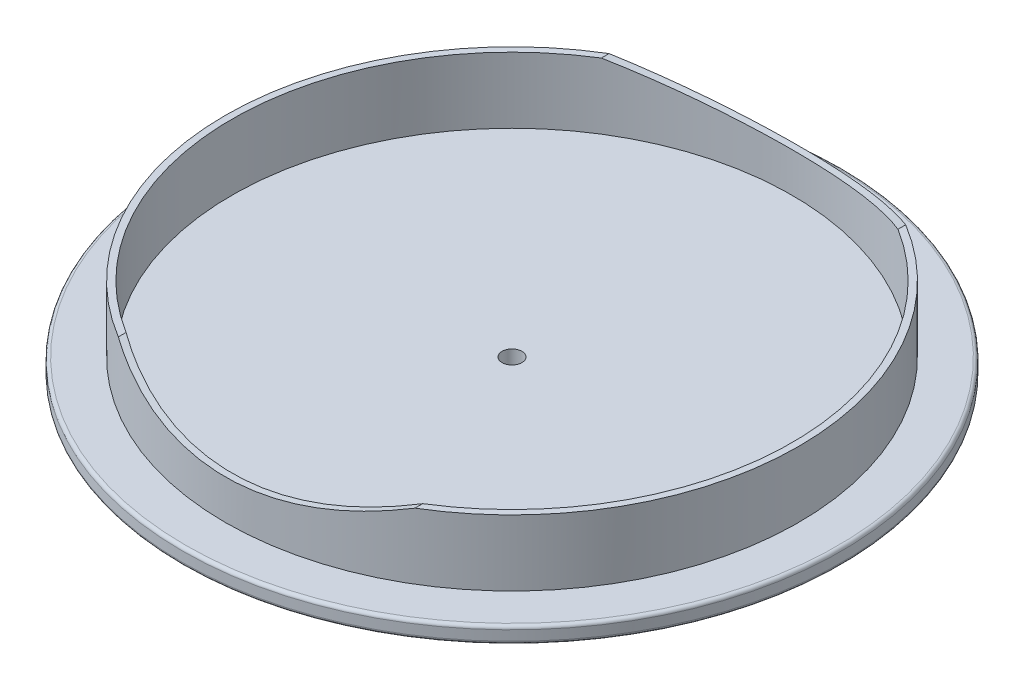
ISO-10303-21;
HEADER;
FILE_DESCRIPTION(('STEP AP214'),'2;1');
FILE_NAME('part.step','',(''),(''),'','','');
FILE_SCHEMA(('AUTOMOTIVE_DESIGN { 1 0 10303 214 1 1 1 1 }'));
ENDSEC;
DATA;
#1=APPLICATION_CONTEXT('core data for automotive mechanical design processes');
#2=APPLICATION_PROTOCOL_DEFINITION('international standard','automotive_design',2000,#1);
#3=PRODUCT_CONTEXT('',#1,'mechanical');
#4=PRODUCT('Part','Part','',(#3));
#5=PRODUCT_RELATED_PRODUCT_CATEGORY('part','',(#4));
#6=PRODUCT_DEFINITION_FORMATION('','',#4);
#7=PRODUCT_DEFINITION_CONTEXT('part definition',#1,'design');
#8=PRODUCT_DEFINITION('design','',#6,#7);
#9=PRODUCT_DEFINITION_SHAPE('','',#8);
#10=(LENGTH_UNIT() NAMED_UNIT(*) SI_UNIT(.MILLI.,.METRE.));
#11=(NAMED_UNIT(*) PLANE_ANGLE_UNIT() SI_UNIT($,.RADIAN.));
#12=(NAMED_UNIT(*) SI_UNIT($,.STERADIAN.) SOLID_ANGLE_UNIT());
#13=UNCERTAINTY_MEASURE_WITH_UNIT(LENGTH_MEASURE(1.E-05),#10,'distance_accuracy_value','');
#14=(GEOMETRIC_REPRESENTATION_CONTEXT(3) GLOBAL_UNCERTAINTY_ASSIGNED_CONTEXT((#13)) GLOBAL_UNIT_ASSIGNED_CONTEXT((#10,
#11,#12)) REPRESENTATION_CONTEXT('',''));
#15=CARTESIAN_POINT('',(0.,0.,0.));
#16=DIRECTION('',(0.,0.,1.));
#17=DIRECTION('',(1.,0.,0.));
#18=AXIS2_PLACEMENT_3D('',#15,#16,#17);
#19=CARTESIAN_POINT('',(0.,25.,0.));
#20=DIRECTION('',(0.,1.,0.));
#21=DIRECTION('',(0.,0.,1.));
#22=AXIS2_PLACEMENT_3D('',#19,#20,#21);
#23=PLANE('',#22);
#24=DIRECTION('',(0.,0.,1.));
#25=VECTOR('',#24,1.);
#26=CARTESIAN_POINT('',(-45.,25.,0.));
#27=LINE('',#26,#25);
#28=CARTESIAN_POINT('',(-45.,25.,-74.4580418759451));
#29=VERTEX_POINT('',#28);
#30=CARTESIAN_POINT('',(-45.,25.,-72.1110255092798));
#31=VERTEX_POINT('',#30);
#32=EDGE_CURVE('E120',#29,#31,#27,.T.);
#33=ORIENTED_EDGE('',*,*,#32,.F.);
#34=CARTESIAN_POINT('',(0.,25.,0.));
#35=DIRECTION('',(0.,1.,0.));
#36=DIRECTION('',(0.,0.,1.));
#37=AXIS2_PLACEMENT_3D('',#34,#35,#36);
#38=CIRCLE('',#37,87.);
#39=CARTESIAN_POINT('',(-45.,25.,74.4580418759452));
#40=VERTEX_POINT('',#39);
#41=EDGE_CURVE('E98',#29,#40,#38,.T.);
#42=ORIENTED_EDGE('',*,*,#41,.T.);
#43=CARTESIAN_POINT('',(-45.,25.,72.1110255092798));
#44=VERTEX_POINT('',#43);
#45=EDGE_CURVE('E117',#44,#40,#27,.T.);
#46=ORIENTED_EDGE('',*,*,#45,.F.);
#47=CARTESIAN_POINT('',(0.,25.,0.));
#48=DIRECTION('',(0.,1.,0.));
#49=DIRECTION('',(0.,0.,1.));
#50=AXIS2_PLACEMENT_3D('',#47,#48,#49);
#51=CIRCLE('',#50,85.);
#52=EDGE_CURVE('E300',#31,#44,#51,.T.);
#53=ORIENTED_EDGE('',*,*,#52,.F.);
#54=EDGE_LOOP('',(#33,#42,#46,#53));
#55=FACE_BOUND('',#54,.T.);
#56=ADVANCED_FACE('F40',(#55),#23,.T.);
#57=CARTESIAN_POINT('',(0.,5.,0.));
#58=DIRECTION('',(0.,-1.,0.));
#59=DIRECTION('',(0.,0.,-1.));
#60=AXIS2_PLACEMENT_3D('',#57,#58,#59);
#61=CYLINDRICAL_SURFACE('',#60,100.);
#62=CARTESIAN_POINT('',(0.,1.,0.));
#63=DIRECTION('',(0.,1.,0.));
#64=DIRECTION('',(0.,0.,1.));
#65=AXIS2_PLACEMENT_3D('',#62,#63,#64);
#66=CIRCLE('',#65,100.);
#67=CARTESIAN_POINT('',(0.,1.,100.));
#68=VERTEX_POINT('',#67);
#69=EDGE_CURVE('E129',#68,#68,#66,.T.);
#70=ORIENTED_EDGE('',*,*,#69,.T.);
#71=EDGE_LOOP('',(#70));
#72=FACE_BOUND('',#71,.T.);
#73=CARTESIAN_POINT('',(0.,4.,0.));
#74=DIRECTION('',(0.,1.,0.));
#75=DIRECTION('',(0.,0.,1.));
#76=AXIS2_PLACEMENT_3D('',#73,#74,#75);
#77=CIRCLE('',#76,100.);
#78=CARTESIAN_POINT('',(0.,4.,100.));
#79=VERTEX_POINT('',#78);
#80=EDGE_CURVE('E125',#79,#79,#77,.F.);
#81=ORIENTED_EDGE('',*,*,#80,.T.);
#82=EDGE_LOOP('',(#81));
#83=FACE_BOUND('',#82,.T.);
#84=ADVANCED_FACE('F145',(#72,#83),#61,.T.);
#85=CARTESIAN_POINT('',(0.,5.,0.));
#86=DIRECTION('',(0.,1.,0.));
#87=DIRECTION('',(0.,0.,1.));
#88=AXIS2_PLACEMENT_3D('',#85,#86,#87);
#89=PLANE('',#88);
#90=CARTESIAN_POINT('',(0.,5.,0.));
#91=DIRECTION('',(0.,1.,0.));
#92=DIRECTION('',(0.,0.,1.));
#93=AXIS2_PLACEMENT_3D('',#90,#91,#92);
#94=CIRCLE('',#93,99.);
#95=CARTESIAN_POINT('',(0.,5.,99.));
#96=VERTEX_POINT('',#95);
#97=EDGE_CURVE('E11',#96,#96,#94,.T.);
#98=ORIENTED_EDGE('',*,*,#97,.T.);
#99=EDGE_LOOP('',(#98));
#100=FACE_BOUND('',#99,.T.);
#101=CARTESIAN_POINT('',(0.,5.,0.));
#102=DIRECTION('',(0.,1.,0.));
#103=DIRECTION('',(0.,0.,1.));
#104=AXIS2_PLACEMENT_3D('',#101,#102,#103);
#105=CIRCLE('',#104,87.);
#106=CARTESIAN_POINT('',(0.,5.,87.));
#107=VERTEX_POINT('',#106);
#108=EDGE_CURVE('E104',#107,#107,#105,.F.);
#109=ORIENTED_EDGE('',*,*,#108,.T.);
#110=EDGE_LOOP('',(#109));
#111=FACE_BOUND('',#110,.T.);
#112=ADVANCED_FACE('F148',(#100,#111),#89,.T.);
#113=CARTESIAN_POINT('',(0.,0.,0.));
#114=DIRECTION('',(0.,1.,0.));
#115=DIRECTION('',(0.,0.,1.));
#116=AXIS2_PLACEMENT_3D('',#113,#114,#115);
#117=PLANE('',#116);
#118=CARTESIAN_POINT('',(0.,0.,0.));
#119=DIRECTION('',(0.,1.,0.));
#120=DIRECTION('',(0.,0.,1.));
#121=AXIS2_PLACEMENT_3D('',#118,#119,#120);
#122=CIRCLE('',#121,99.);
#123=CARTESIAN_POINT('',(0.,0.,99.));
#124=VERTEX_POINT('',#123);
#125=EDGE_CURVE('E49',#124,#124,#122,.F.);
#126=ORIENTED_EDGE('',*,*,#125,.T.);
#127=EDGE_LOOP('',(#126));
#128=FACE_BOUND('',#127,.T.);
#129=CARTESIAN_POINT('',(0.,0.,0.));
#130=DIRECTION('',(0.,-1.,0.));
#131=DIRECTION('',(0.,0.,-1.));
#132=AXIS2_PLACEMENT_3D('',#129,#130,#131);
#133=CIRCLE('',#132,3.);
#134=CARTESIAN_POINT('',(0.,0.,-3.));
#135=VERTEX_POINT('',#134);
#136=EDGE_CURVE('E124',#135,#135,#133,.T.);
#137=ORIENTED_EDGE('',*,*,#136,.F.);
#138=EDGE_LOOP('',(#137));
#139=FACE_BOUND('',#138,.T.);
#140=ADVANCED_FACE('F136',(#128,#139),#117,.F.);
#141=CARTESIAN_POINT('',(0.,25.,0.));
#142=DIRECTION('',(0.,-1.,0.));
#143=DIRECTION('',(0.,0.,-1.));
#144=AXIS2_PLACEMENT_3D('',#141,#142,#143);
#145=CYLINDRICAL_SURFACE('',#144,85.);
#146=CARTESIAN_POINT('',(45.,25.,72.1110255092798));
#147=CARTESIAN_POINT('',(44.1196399149225,24.67604527969,72.6604079457032));
#148=CARTESIAN_POINT('',(43.2274717346262,24.3585614097653,73.1947499525586));
#149=CARTESIAN_POINT('',(41.4202748555109,23.737954583108,74.2323811909152));
#150=CARTESIAN_POINT('',(40.5052443176095,23.4348327873994,74.7356679129109));
#151=CARTESIAN_POINT('',(38.652609107667,22.8442270867435,75.7104494899658));
#152=CARTESIAN_POINT('',(37.7149899241868,22.5567536431745,76.1819231263027));
#153=CARTESIAN_POINT('',(35.818752230828,21.9990745523937,77.0916517804029));
#154=CARTESIAN_POINT('',(34.8601341825929,21.7288685260819,77.5299075274924));
#155=CARTESIAN_POINT('',(32.9192102534251,21.2060743399801,78.3737822442774));
#156=CARTESIAN_POINT('',(31.9368269398033,20.9535585511003,78.779268084678));
#157=CARTESIAN_POINT('',(29.9531380625713,20.4686158404158,79.5546582609057));
#158=CARTESIAN_POINT('',(28.9518310869641,20.2361904249323,79.9245599289632));
#159=CARTESIAN_POINT('',(26.931979095447,19.7927693887239,80.6276115282762));
#160=CARTESIAN_POINT('',(25.9134380979818,19.5817688505665,80.9607698943646));
#161=CARTESIAN_POINT('',(23.8604333355653,19.182329096251,81.5894122726126));
#162=CARTESIAN_POINT('',(22.8259697733812,18.9938895930554,81.8848967640894));
#163=CARTESIAN_POINT('',(20.7381213786668,18.6398754285808,82.4384734092067));
#164=CARTESIAN_POINT('',(19.6846726364239,18.4744067412472,82.6963925103039));
#165=CARTESIAN_POINT('',(17.565330407932,18.1683515956712,83.1723425581564));
#166=CARTESIAN_POINT('',(16.4994382083142,18.0277625887835,83.3903775906662));
#167=CARTESIAN_POINT('',(14.3569369358138,17.7723013688981,83.7858291882377));
#168=CARTESIAN_POINT('',(13.2803265029446,17.6574324639857,83.9632405284006));
#169=CARTESIAN_POINT('',(11.118618968165,17.4541634954411,84.2767412235537));
#170=CARTESIAN_POINT('',(10.03352188556,17.3657633716158,84.4128306725148));
#171=CARTESIAN_POINT('',(7.85992655574878,17.2162018422356,84.6428539742002));
#172=CARTESIAN_POINT('',(6.7714450161567,17.1549686573637,84.7368989202137));
#173=CARTESIAN_POINT('',(4.59046968039169,17.0597971636763,84.8829905221165));
#174=CARTESIAN_POINT('',(3.49797587061852,17.0258589474676,84.9350370355129));
#175=CARTESIAN_POINT('',(1.31137184449048,16.9855022841045,84.9969204491268));
#176=CARTESIAN_POINT('',(0.217261761631949,16.9790816787627,85.0067606595558));
#177=CARTESIAN_POINT('',(-1.97032642129245,16.9937972688161,84.9842001716019));
#178=CARTESIAN_POINT('',(-3.06380453075877,17.0149330431814,84.9518001186017));
#179=CARTESIAN_POINT('',(-5.17034521802126,17.0821474740728,84.8486851013626));
#180=CARTESIAN_POINT('',(-6.18361043186129,17.1263506420405,84.7808507506301));
#181=CARTESIAN_POINT('',(-8.20587103441968,17.2381746796294,84.6090628308341));
#182=CARTESIAN_POINT('',(-9.21486603404837,17.3057976385945,84.5051060391855));
#183=CARTESIAN_POINT('',(-11.2265950352886,17.4640736783973,84.2614388367478));
#184=CARTESIAN_POINT('',(-12.2293297101681,17.554724237439,84.121732340964));
#185=CARTESIAN_POINT('',(-14.2270262958764,17.7585687266492,83.8070061968216));
#186=CARTESIAN_POINT('',(-15.2219874715793,17.8717647627165,83.6319832496496));
#187=CARTESIAN_POINT('',(-17.2041566003834,18.1203021397879,83.2468505904314));
#188=CARTESIAN_POINT('',(-18.1913477099709,18.2556823295129,83.0366793133718));
#189=CARTESIAN_POINT('',(-20.1547287166568,18.5477397815477,82.5820950532443));
#190=CARTESIAN_POINT('',(-21.1309175064644,18.7044191670779,82.3376786563605));
#191=CARTESIAN_POINT('',(-23.070563460173,19.0382230764939,81.815387353444));
#192=CARTESIAN_POINT('',(-24.0340230294754,19.2153436742558,81.53751887208));
#193=CARTESIAN_POINT('',(-25.9470727926093,19.589159717572,80.9490653755188));
#194=CARTESIAN_POINT('',(-26.8966621337465,19.7858563608352,80.6384783584561));
#195=CARTESIAN_POINT('',(-29.3623094533871,20.3250589981669,79.7837965622487));
#196=CARTESIAN_POINT('',(-30.8662384051792,20.6826263826892,79.2138996795594));
#197=CARTESIAN_POINT('',(-33.8296266631034,21.4420159207217,77.9943858622051));
#198=CARTESIAN_POINT('',(-35.2890886799761,21.8438353696713,77.3447737992288));
#199=CARTESIAN_POINT('',(-38.1537133417568,22.68526538557,75.9723970685557));
#200=CARTESIAN_POINT('',(-39.5590847324267,23.1247037987491,75.2499632104127));
#201=CARTESIAN_POINT('',(-41.6286834718322,23.8095699884585,74.1125671393256));
#202=CARTESIAN_POINT('',(-42.3121283457199,24.0421391761265,73.7244848452078));
#203=CARTESIAN_POINT('',(-43.6659342104977,24.5152433460593,72.9308006343499));
#204=CARTESIAN_POINT('',(-44.3362956106492,24.7557780785186,72.5251992668998));
#205=CARTESIAN_POINT('',(-45.,25.,72.1110255092798));
#206=B_SPLINE_CURVE_WITH_KNOTS('',3,(#146,#147,#148,#149,#150,#151,#152,#153,#154,#155,#156,
#157,#158,#159,#160,#161,#162,#163,#164,#165,#166,#167,#168,#169,#170,#171,#172,#173,#174,#175,
#176,#177,#178,#179,#180,#181,#182,#183,#184,#185,#186,#187,#188,#189,#190,#191,#192,#193,#194,
#195,#196,#197,#198,#199,#200,#201,#202,#203,#204,#205),.UNSPECIFIED.,.F.,.F.,(4,2,2,2,2,2,2,2,
2,2,2,2,2,2,2,2,2,2,2,2,2,2,2,2,2,2,2,2,2,4),(0.,3.26118315443682,6.52262949333754,
9.78623008088134,13.0497589926209,16.3259414237849,19.602369281463,22.8780434262795,
26.1536758911895,29.4439508216253,32.7338885047851,36.0242490925873,39.3146021976553,
42.5962091326763,45.8778272015271,49.1591878905972,52.4404984448323,55.489070987851,
58.5379155725066,61.5864264162723,64.6352221450522,67.6894151063797,70.7439127499546,
73.7978246924352,76.851923595468,81.791117498329,86.7300096990164,91.6473987018074,
94.1060069731671,96.5645382136414),.UNSPECIFIED.);
#207=CARTESIAN_POINT('',(45.,25.,72.1110255092798));
#208=VERTEX_POINT('',#207);
#209=EDGE_CURVE('E202',#208,#44,#206,.T.);
#210=ORIENTED_EDGE('',*,*,#209,.F.);
#211=CARTESIAN_POINT('',(45.,25.,-72.1110255092798));
#212=VERTEX_POINT('',#211);
#213=EDGE_CURVE('E110',#208,#212,#51,.T.);
#214=ORIENTED_EDGE('',*,*,#213,.T.);
#215=CARTESIAN_POINT('',(-45.,25.,-72.1110255092798));
#216=CARTESIAN_POINT('',(-44.1196399149225,24.67604527969,-72.6604079457032));
#217=CARTESIAN_POINT('',(-43.2274717346262,24.3585614097653,-73.1947499525586));
#218=CARTESIAN_POINT('',(-41.4202748555109,23.737954583108,-74.2323811909152));
#219=CARTESIAN_POINT('',(-40.5052443176095,23.4348327873994,-74.7356679129109));
#220=CARTESIAN_POINT('',(-38.652609107667,22.8442270867435,-75.7104494899658));
#221=CARTESIAN_POINT('',(-37.7149899241868,22.5567536431745,-76.1819231263027));
#222=CARTESIAN_POINT('',(-35.818752230828,21.9990745523937,-77.0916517804029));
#223=CARTESIAN_POINT('',(-34.8601341825929,21.7288685260819,-77.5299075274924));
#224=CARTESIAN_POINT('',(-32.9192102534251,21.2060743399801,-78.3737822442774));
#225=CARTESIAN_POINT('',(-31.9368269398033,20.9535585511003,-78.779268084678));
#226=CARTESIAN_POINT('',(-29.9531380625713,20.4686158404158,-79.5546582609057));
#227=CARTESIAN_POINT('',(-28.9518310869641,20.2361904249323,-79.9245599289632));
#228=CARTESIAN_POINT('',(-26.931979095447,19.7927693887239,-80.6276115282762));
#229=CARTESIAN_POINT('',(-25.9134380979818,19.5817688505665,-80.9607698943646));
#230=CARTESIAN_POINT('',(-23.8604333355653,19.182329096251,-81.5894122726126));
#231=CARTESIAN_POINT('',(-22.8259697733812,18.9938895930554,-81.8848967640894));
#232=CARTESIAN_POINT('',(-20.7381213786668,18.6398754285808,-82.4384734092067));
#233=CARTESIAN_POINT('',(-19.6846726364239,18.4744067412472,-82.6963925103039));
#234=CARTESIAN_POINT('',(-17.565330407932,18.1683515956712,-83.1723425581564));
#235=CARTESIAN_POINT('',(-16.4994382083142,18.0277625887835,-83.3903775906662));
#236=CARTESIAN_POINT('',(-14.3569369358138,17.7723013688981,-83.7858291882377));
#237=CARTESIAN_POINT('',(-13.2803265029446,17.6574324639857,-83.9632405284006));
#238=CARTESIAN_POINT('',(-11.118618968165,17.4541634954411,-84.2767412235537));
#239=CARTESIAN_POINT('',(-10.03352188556,17.3657633716158,-84.4128306725148));
#240=CARTESIAN_POINT('',(-7.85992655574878,17.2162018422356,-84.6428539742002));
#241=CARTESIAN_POINT('',(-6.7714450161567,17.1549686573637,-84.7368989202137));
#242=CARTESIAN_POINT('',(-4.5904696803917,17.0597971636763,-84.8829905221165));
#243=CARTESIAN_POINT('',(-3.49797587061852,17.0258589474676,-84.9350370355129));
#244=CARTESIAN_POINT('',(-1.31137184449048,16.9855022841045,-84.9969204491268));
#245=CARTESIAN_POINT('',(-0.217261761631949,16.9790816787627,-85.0067606595558));
#246=CARTESIAN_POINT('',(1.97032642129245,16.9937972688161,-84.9842001716019));
#247=CARTESIAN_POINT('',(3.06380453075877,17.0149330431814,-84.9518001186017));
#248=CARTESIAN_POINT('',(5.17034521802126,17.0821474740728,-84.8486851013626));
#249=CARTESIAN_POINT('',(6.18361043186129,17.1263506420405,-84.7808507506301));
#250=CARTESIAN_POINT('',(8.20587103441968,17.2381746796294,-84.6090628308341));
#251=CARTESIAN_POINT('',(9.21486603404837,17.3057976385945,-84.5051060391855));
#252=CARTESIAN_POINT('',(11.2265950352886,17.4640736783973,-84.2614388367478));
#253=CARTESIAN_POINT('',(12.2293297101681,17.554724237439,-84.121732340964));
#254=CARTESIAN_POINT('',(14.2270262958764,17.7585687266492,-83.8070061968216));
#255=CARTESIAN_POINT('',(15.2219874715793,17.8717647627165,-83.6319832496496));
#256=CARTESIAN_POINT('',(17.2041566003834,18.1203021397879,-83.2468505904314));
#257=CARTESIAN_POINT('',(18.1913477099709,18.2556823295129,-83.0366793133719));
#258=CARTESIAN_POINT('',(20.1547287166568,18.5477397815477,-82.5820950532443));
#259=CARTESIAN_POINT('',(21.1309175064644,18.7044191670779,-82.3376786563605));
#260=CARTESIAN_POINT('',(23.070563460173,19.0382230764939,-81.815387353444));
#261=CARTESIAN_POINT('',(24.0340230294754,19.2153436742558,-81.53751887208));
#262=CARTESIAN_POINT('',(25.9470727926093,19.589159717572,-80.9490653755188));
#263=CARTESIAN_POINT('',(26.8966621337465,19.7858563608352,-80.6384783584561));
#264=CARTESIAN_POINT('',(29.3623094533871,20.3250589981669,-79.7837965622487));
#265=CARTESIAN_POINT('',(30.8662384051792,20.6826263826892,-79.2138996795594));
#266=CARTESIAN_POINT('',(33.8296266631034,21.4420159207217,-77.9943858622051));
#267=CARTESIAN_POINT('',(35.2890886799761,21.8438353696713,-77.3447737992289));
#268=CARTESIAN_POINT('',(38.1537133417567,22.68526538557,-75.9723970685557));
#269=CARTESIAN_POINT('',(39.5590847324266,23.1247037987491,-75.2499632104127));
#270=CARTESIAN_POINT('',(41.6286834718322,23.8095699884584,-74.1125671393256));
#271=CARTESIAN_POINT('',(42.3121283457199,24.0421391761265,-73.7244848452078));
#272=CARTESIAN_POINT('',(43.6659342104976,24.5152433460593,-72.93080063435));
#273=CARTESIAN_POINT('',(44.3362956106492,24.7557780785186,-72.5251992668998));
#274=CARTESIAN_POINT('',(45.,25.,-72.1110255092798));
#275=B_SPLINE_CURVE_WITH_KNOTS('',3,(#215,#216,#217,#218,#219,#220,#221,#222,#223,#224,#225,
#226,#227,#228,#229,#230,#231,#232,#233,#234,#235,#236,#237,#238,#239,#240,#241,#242,#243,#244,
#245,#246,#247,#248,#249,#250,#251,#252,#253,#254,#255,#256,#257,#258,#259,#260,#261,#262,#263,
#264,#265,#266,#267,#268,#269,#270,#271,#272,#273,#274),.UNSPECIFIED.,.F.,.F.,(4,2,2,2,2,2,2,2,
2,2,2,2,2,2,2,2,2,2,2,2,2,2,2,2,2,2,2,2,2,4),(0.,3.26118315443682,6.52262949333754,
9.78623008088134,13.0497589926209,16.3259414237849,19.602369281463,22.8780434262795,
26.1536758911895,29.4439508216253,32.7338885047851,36.0242490925873,39.3146021976553,
42.5962091326762,45.8778272015271,49.1591878905972,52.4404984448323,55.489070987851,
58.5379155725066,61.5864264162723,64.6352221450522,67.6894151063797,70.7439127499546,
73.7978246924352,76.851923595468,81.7911174983289,86.7300096990163,91.6473987018073,
94.1060069731671,96.5645382136413),.UNSPECIFIED.);
#276=EDGE_CURVE('E64',#31,#212,#275,.T.);
#277=ORIENTED_EDGE('',*,*,#276,.F.);
#278=ORIENTED_EDGE('',*,*,#52,.T.);
#279=EDGE_LOOP('',(#210,#214,#277,#278));
#280=FACE_BOUND('',#279,.T.);
#281=CARTESIAN_POINT('',(0.,5.,0.));
#282=DIRECTION('',(0.,1.,0.));
#283=DIRECTION('',(0.,0.,1.));
#284=AXIS2_PLACEMENT_3D('',#281,#282,#283);
#285=CIRCLE('',#284,85.);
#286=CARTESIAN_POINT('',(0.,5.,85.));
#287=VERTEX_POINT('',#286);
#288=EDGE_CURVE('E90',#287,#287,#285,.F.);
#289=ORIENTED_EDGE('',*,*,#288,.T.);
#290=EDGE_LOOP('',(#289));
#291=FACE_BOUND('',#290,.T.);
#292=ADVANCED_FACE('F163',(#280,#291),#145,.F.);
#293=CARTESIAN_POINT('',(0.,25.,0.));
#294=DIRECTION('',(0.,-1.,0.));
#295=DIRECTION('',(0.,0.,-1.));
#296=AXIS2_PLACEMENT_3D('',#293,#294,#295);
#297=CYLINDRICAL_SURFACE('',#296,87.);
#298=ORIENTED_EDGE('',*,*,#108,.F.);
#299=EDGE_LOOP('',(#298));
#300=FACE_BOUND('',#299,.T.);
#301=CARTESIAN_POINT('',(45.,25.,74.4580418759451));
#302=VERTEX_POINT('',#301);
#303=CARTESIAN_POINT('',(45.,25.,-74.4580418759451));
#304=VERTEX_POINT('',#303);
#305=EDGE_CURVE('E96',#302,#304,#38,.T.);
#306=ORIENTED_EDGE('',*,*,#305,.F.);
#307=CARTESIAN_POINT('',(45.,25.,74.4580418759451));
#308=CARTESIAN_POINT('',(44.1007630946444,24.6690989324827,75.0015162915429));
#309=CARTESIAN_POINT('',(43.1897694511047,24.3451560535599,75.5298452397679));
#310=CARTESIAN_POINT('',(41.3450336231143,23.712602758824,76.555220000648));
#311=CARTESIAN_POINT('',(40.4112895581154,23.4039936169486,77.0522632149746));
#312=CARTESIAN_POINT('',(38.5213358681514,22.8033785964623,78.0143052124163));
#313=CARTESIAN_POINT('',(37.565111644555,22.5113839531934,78.4792823552692));
#314=CARTESIAN_POINT('',(35.6318133246348,21.9456333585495,79.3757466272016));
#315=CARTESIAN_POINT('',(34.6547397013469,21.6718769939601,79.8072345150649));
#316=CARTESIAN_POINT('',(32.6771980890959,21.142988944136,80.6371800614238));
#317=CARTESIAN_POINT('',(31.6766571831081,20.8879295785327,81.0355101963723));
#318=CARTESIAN_POINT('',(29.656864060398,20.3988615702451,81.7963023338464));
#319=CARTESIAN_POINT('',(28.6376104512344,20.1648545018021,82.1587616542393));
#320=CARTESIAN_POINT('',(26.5821187030981,19.7192253918734,82.8466367794731));
#321=CARTESIAN_POINT('',(25.5458845889183,19.5075981319902,83.172061221252));
#322=CARTESIAN_POINT('',(23.4577759737535,19.1078474392221,83.784942978809));
#323=CARTESIAN_POINT('',(22.405901671228,18.9197237083834,84.0724007758922));
#324=CARTESIAN_POINT('',(20.2834492887564,18.5672680204816,84.609605788297));
#325=CARTESIAN_POINT('',(19.2128083911791,18.403046801041,84.8591776982344));
#326=CARTESIAN_POINT('',(17.0594460099921,18.1004046499239,85.318152051273));
#327=CARTESIAN_POINT('',(15.9767257723032,17.9619810829591,85.5275585974205));
#328=CARTESIAN_POINT('',(13.8009669911539,17.7117455805625,85.9054866817904));
#329=CARTESIAN_POINT('',(12.7079271284853,17.599937096698,86.0740029172228));
#330=CARTESIAN_POINT('',(10.5137998896832,17.4036559073681,86.369470123347));
#331=CARTESIAN_POINT('',(9.41271253132772,17.3191831415325,86.4964211858343));
#332=CARTESIAN_POINT('',(7.20753503097848,17.1782919951547,86.7079880507936));
#333=CARTESIAN_POINT('',(6.10345972863342,17.1218025523852,86.7927110925885));
#334=CARTESIAN_POINT('',(3.89179580168273,17.0369188784921,86.9199679693718));
#335=CARTESIAN_POINT('',(2.78420716542499,17.0085247406456,86.9625016642905));
#336=CARTESIAN_POINT('',(0.5679375936214,16.9800169749223,87.0052054698802));
#337=CARTESIAN_POINT('',(-0.540743249296764,16.9799011259289,87.0053789077353));
#338=CARTESIAN_POINT('',(-2.75693291000832,17.0079456399555,86.9633692395956));
#339=CARTESIAN_POINT('',(-3.86444174492818,17.0361055839081,86.9211867613455));
#340=CARTESIAN_POINT('',(-5.99921292742137,17.1175870066945,86.7990314447751));
#341=CARTESIAN_POINT('',(-7.02671054351326,17.1690267745976,86.7218842312415));
#342=CARTESIAN_POINT('',(-9.07694030483076,17.2959518982482,86.5313189984804));
#343=CARTESIAN_POINT('',(-10.0996720161482,17.3714394016233,86.4178977397287));
#344=CARTESIAN_POINT('',(-12.1383785630853,17.5460343523115,86.1551856378471));
#345=CARTESIAN_POINT('',(-13.1543540701406,17.6451394153185,86.0058984155464));
#346=CARTESIAN_POINT('',(-15.1780286873002,17.8664466409013,85.6719280131932));
#347=CARTESIAN_POINT('',(-16.1857270251576,17.9886509336228,85.4872415687024));
#348=CARTESIAN_POINT('',(-18.192710664281,18.2557134473861,85.0827529341154));
#349=CARTESIAN_POINT('',(-19.1919800638522,18.4006073359163,84.862895444058));
#350=CARTESIAN_POINT('',(-21.1790343485961,18.712168824839,84.3889323018382));
#351=CARTESIAN_POINT('',(-22.1668180591689,18.8788386312159,84.1348231797707));
#352=CARTESIAN_POINT('',(-24.1291546821272,19.2330590572008,83.5931795747111));
#353=CARTESIAN_POINT('',(-25.1037103960712,19.4206051754804,83.3056522967188));
#354=CARTESIAN_POINT('',(-27.0384969074545,19.8156832075788,82.6979326571421));
#355=CARTESIAN_POINT('',(-27.9987269861871,20.0232161202524,82.3777386629669));
#356=CARTESIAN_POINT('',(-30.3691285006969,20.5633564606214,81.5412557214367));
#357=CARTESIAN_POINT('',(-31.7698912649103,20.90752869174,81.0055981065217));
#358=CARTESIAN_POINT('',(-34.5331278692465,21.6344220554028,79.8667415097827));
#359=CARTESIAN_POINT('',(-35.8956059587059,22.0171388879713,79.2635500610911));
#360=CARTESIAN_POINT('',(-38.5736732027163,22.8157325393708,77.9952382599325));
#361=CARTESIAN_POINT('',(-39.8894395716772,23.2314588801894,77.3303968528272));
#362=CARTESIAN_POINT('',(-42.4777324955333,24.0936388264913,75.9394598234338));
#363=CARTESIAN_POINT('',(-43.7502616837941,24.5400905556124,75.2133679410279));
#364=CARTESIAN_POINT('',(-45.,25.,74.4580418759451));
#365=B_SPLINE_CURVE_WITH_KNOTS('',3,(#307,#308,#309,#310,#311,#312,#313,#314,#315,#316,#317,
#318,#319,#320,#321,#322,#323,#324,#325,#326,#327,#328,#329,#330,#331,#332,#333,#334,#335,#336,
#337,#338,#339,#340,#341,#342,#343,#344,#345,#346,#347,#348,#349,#350,#351,#352,#353,#354,#355,
#356,#357,#358,#359,#360,#361,#362,#363,#364),.UNSPECIFIED.,.F.,.F.,(4,2,2,2,2,2,2,2,2,2,2,2,2,
2,2,2,2,2,2,2,2,2,2,2,2,2,2,2,4),(0.,3.30461474221973,6.60950357665808,9.91660136909752,
13.2236242089889,16.5428286680088,19.8622811233747,23.1809578529187,26.4995925073893,
29.8331434550315,33.1663536860506,36.4999959480028,39.8336308476556,43.1587561891725,
46.4838925701606,49.8087677784122,53.1335937103715,56.2276913644256,59.322065420102,
62.4161272160893,65.5104744770418,68.6097357307464,71.7093111953607,74.8082196226415,
77.9072830006017,82.5206396714201,87.1334822522491,91.7263866700038,96.3190108530978),.UNSPECIFIED.);
#366=EDGE_CURVE('E56',#302,#40,#365,.T.);
#367=ORIENTED_EDGE('',*,*,#366,.T.);
#368=ORIENTED_EDGE('',*,*,#41,.F.);
#369=CARTESIAN_POINT('',(-45.,25.,-74.4580418759451));
#370=CARTESIAN_POINT('',(-44.1007630946444,24.6690989324827,-75.0015162915429));
#371=CARTESIAN_POINT('',(-43.1897694511047,24.3451560535599,-75.5298452397678));
#372=CARTESIAN_POINT('',(-41.3450336231143,23.712602758824,-76.555220000648));
#373=CARTESIAN_POINT('',(-40.4112895581154,23.4039936169486,-77.0522632149746));
#374=CARTESIAN_POINT('',(-38.5213358681514,22.8033785964623,-78.0143052124163));
#375=CARTESIAN_POINT('',(-37.565111644555,22.5113839531934,-78.4792823552692));
#376=CARTESIAN_POINT('',(-35.6318133246348,21.9456333585495,-79.3757466272016));
#377=CARTESIAN_POINT('',(-34.6547397013469,21.67187699396,-79.8072345150649));
#378=CARTESIAN_POINT('',(-32.6771980890959,21.142988944136,-80.6371800614238));
#379=CARTESIAN_POINT('',(-31.6766571831081,20.8879295785327,-81.0355101963723));
#380=CARTESIAN_POINT('',(-29.6568640603981,20.3988615702451,-81.7963023338464));
#381=CARTESIAN_POINT('',(-28.6376104512344,20.1648545018021,-82.1587616542393));
#382=CARTESIAN_POINT('',(-26.5821187030981,19.7192253918734,-82.8466367794731));
#383=CARTESIAN_POINT('',(-25.5458845889183,19.5075981319902,-83.172061221252));
#384=CARTESIAN_POINT('',(-23.4577759737535,19.1078474392221,-83.784942978809));
#385=CARTESIAN_POINT('',(-22.405901671228,18.9197237083834,-84.0724007758922));
#386=CARTESIAN_POINT('',(-20.2834492887564,18.5672680204816,-84.609605788297));
#387=CARTESIAN_POINT('',(-19.2128083911791,18.403046801041,-84.8591776982344));
#388=CARTESIAN_POINT('',(-17.0594460099921,18.1004046499239,-85.318152051273));
#389=CARTESIAN_POINT('',(-15.9767257723032,17.9619810829591,-85.5275585974205));
#390=CARTESIAN_POINT('',(-13.8009669911539,17.7117455805625,-85.9054866817904));
#391=CARTESIAN_POINT('',(-12.7079271284853,17.599937096698,-86.0740029172228));
#392=CARTESIAN_POINT('',(-10.5137998896832,17.4036559073681,-86.369470123347));
#393=CARTESIAN_POINT('',(-9.41271253132772,17.3191831415325,-86.4964211858343));
#394=CARTESIAN_POINT('',(-7.20753503097848,17.1782919951548,-86.7079880507936));
#395=CARTESIAN_POINT('',(-6.10345972863342,17.1218025523852,-86.7927110925885));
#396=CARTESIAN_POINT('',(-3.89179580168273,17.0369188784921,-86.9199679693718));
#397=CARTESIAN_POINT('',(-2.78420716542498,17.0085247406456,-86.9625016642905));
#398=CARTESIAN_POINT('',(-0.567937593621398,16.9800169749223,-87.0052054698802));
#399=CARTESIAN_POINT('',(0.540743249296764,16.9799011259289,-87.0053789077354));
#400=CARTESIAN_POINT('',(2.75693291000832,17.0079456399555,-86.9633692395956));
#401=CARTESIAN_POINT('',(3.86444174492818,17.0361055839081,-86.9211867613455));
#402=CARTESIAN_POINT('',(5.99921292742137,17.1175870066945,-86.7990314447751));
#403=CARTESIAN_POINT('',(7.02671054351326,17.1690267745976,-86.7218842312415));
#404=CARTESIAN_POINT('',(9.07694030483076,17.2959518982482,-86.5313189984804));
#405=CARTESIAN_POINT('',(10.0996720161482,17.3714394016233,-86.4178977397287));
#406=CARTESIAN_POINT('',(12.1383785630853,17.5460343523116,-86.1551856378471));
#407=CARTESIAN_POINT('',(13.1543540701406,17.6451394153185,-86.0058984155464));
#408=CARTESIAN_POINT('',(15.1780286873002,17.8664466409013,-85.6719280131932));
#409=CARTESIAN_POINT('',(16.1857270251576,17.9886509336228,-85.4872415687024));
#410=CARTESIAN_POINT('',(18.192710664281,18.2557134473861,-85.0827529341154));
#411=CARTESIAN_POINT('',(19.1919800638522,18.4006073359163,-84.862895444058));
#412=CARTESIAN_POINT('',(21.1790343485961,18.712168824839,-84.3889323018382));
#413=CARTESIAN_POINT('',(22.1668180591689,18.8788386312159,-84.1348231797707));
#414=CARTESIAN_POINT('',(24.1291546821272,19.2330590572008,-83.5931795747111));
#415=CARTESIAN_POINT('',(25.1037103960712,19.4206051754804,-83.3056522967188));
#416=CARTESIAN_POINT('',(27.0384969074545,19.8156832075788,-82.697932657142));
#417=CARTESIAN_POINT('',(27.9987269861871,20.0232161202524,-82.3777386629669));
#418=CARTESIAN_POINT('',(30.3691285006969,20.5633564606214,-81.5412557214367));
#419=CARTESIAN_POINT('',(31.7698912649103,20.90752869174,-81.0055981065217));
#420=CARTESIAN_POINT('',(34.5331278692464,21.6344220554028,-79.8667415097827));
#421=CARTESIAN_POINT('',(35.8956059587059,22.0171388879713,-79.2635500610911));
#422=CARTESIAN_POINT('',(38.5736732027163,22.8157325393708,-77.9952382599325));
#423=CARTESIAN_POINT('',(39.8894395716772,23.2314588801894,-77.3303968528272));
#424=CARTESIAN_POINT('',(42.4777324955332,24.0936388264913,-75.9394598234338));
#425=CARTESIAN_POINT('',(43.750261683794,24.5400905556124,-75.213367941028));
#426=CARTESIAN_POINT('',(45.,25.,-74.4580418759452));
#427=B_SPLINE_CURVE_WITH_KNOTS('',3,(#369,#370,#371,#372,#373,#374,#375,#376,#377,#378,#379,
#380,#381,#382,#383,#384,#385,#386,#387,#388,#389,#390,#391,#392,#393,#394,#395,#396,#397,#398,
#399,#400,#401,#402,#403,#404,#405,#406,#407,#408,#409,#410,#411,#412,#413,#414,#415,#416,#417,
#418,#419,#420,#421,#422,#423,#424,#425,#426),.UNSPECIFIED.,.F.,.F.,(4,2,2,2,2,2,2,2,2,2,2,2,2,
2,2,2,2,2,2,2,2,2,2,2,2,2,2,2,4),(0.,3.30461474221974,6.60950357665808,9.91660136909753,
13.2236242089889,16.5428286680088,19.8622811233747,23.1809578529187,26.4995925073893,
29.8331434550315,33.1663536860506,36.4999959480028,39.8336308476556,43.1587561891725,
46.4838925701606,49.8087677784122,53.1335937103715,56.2276913644256,59.322065420102,
62.4161272160893,65.5104744770418,68.6097357307464,71.7093111953607,74.8082196226416,
77.9072830006017,82.5206396714201,87.1334822522491,91.7263866700039,96.3190108530978),.UNSPECIFIED.);
#428=EDGE_CURVE('E82',#29,#304,#427,.T.);
#429=ORIENTED_EDGE('',*,*,#428,.T.);
#430=EDGE_LOOP('',(#306,#367,#368,#429));
#431=FACE_BOUND('',#430,.T.);
#432=ADVANCED_FACE('F95',(#300,#431),#297,.T.);
#433=DIRECTION('',(0.,0.,-1.));
#434=VECTOR('',#433,1.);
#435=CARTESIAN_POINT('',(45.,25.,0.));
#436=LINE('',#435,#434);
#437=EDGE_CURVE('E89',#302,#208,#436,.T.);
#438=ORIENTED_EDGE('',*,*,#437,.F.);
#439=ORIENTED_EDGE('',*,*,#305,.T.);
#440=EDGE_CURVE('E79',#212,#304,#436,.T.);
#441=ORIENTED_EDGE('',*,*,#440,.F.);
#442=ORIENTED_EDGE('',*,*,#213,.F.);
#443=EDGE_LOOP('',(#438,#439,#441,#442));
#444=FACE_BOUND('',#443,.T.);
#445=ADVANCED_FACE('F102',(#444),#23,.T.);
#446=CARTESIAN_POINT('',(0.,5.,0.));
#447=DIRECTION('',(0.,1.,0.));
#448=DIRECTION('',(0.,0.,1.));
#449=AXIS2_PLACEMENT_3D('',#446,#447,#448);
#450=CIRCLE('',#449,3.);
#451=CARTESIAN_POINT('',(0.,5.,3.));
#452=VERTEX_POINT('',#451);
#453=EDGE_CURVE('E100',#452,#452,#450,.T.);
#454=ORIENTED_EDGE('',*,*,#453,.F.);
#455=EDGE_LOOP('',(#454));
#456=FACE_BOUND('',#455,.T.);
#457=ORIENTED_EDGE('',*,*,#288,.F.);
#458=EDGE_LOOP('',(#457));
#459=FACE_BOUND('',#458,.T.);
#460=ADVANCED_FACE('F159',(#456,#459),#89,.T.);
#461=CARTESIAN_POINT('',(0.,147.293612955009,-100.));
#462=DIRECTION('',(0.,0.,1.));
#463=DIRECTION('',(1.,0.,0.));
#464=AXIS2_PLACEMENT_3D('',#461,#462,#463);
#465=CYLINDRICAL_SURFACE('',#464,130.310121516287);
#466=ORIENTED_EDGE('',*,*,#276,.T.);
#467=ORIENTED_EDGE('',*,*,#440,.T.);
#468=ORIENTED_EDGE('',*,*,#428,.F.);
#469=ORIENTED_EDGE('',*,*,#32,.T.);
#470=EDGE_LOOP('',(#466,#467,#468,#469));
#471=FACE_BOUND('',#470,.T.);
#472=ADVANCED_FACE('F81',(#471),#465,.F.);
#473=ORIENTED_EDGE('',*,*,#209,.T.);
#474=ORIENTED_EDGE('',*,*,#45,.T.);
#475=ORIENTED_EDGE('',*,*,#366,.F.);
#476=ORIENTED_EDGE('',*,*,#437,.T.);
#477=EDGE_LOOP('',(#473,#474,#475,#476));
#478=FACE_BOUND('',#477,.T.);
#479=ADVANCED_FACE('F179',(#478),#465,.F.);
#480=CARTESIAN_POINT('',(0.,25.,0.));
#481=DIRECTION('',(0.,-1.,0.));
#482=DIRECTION('',(0.,0.,-1.));
#483=AXIS2_PLACEMENT_3D('',#480,#481,#482);
#484=CYLINDRICAL_SURFACE('',#483,3.);
#485=ORIENTED_EDGE('',*,*,#453,.T.);
#486=EDGE_LOOP('',(#485));
#487=FACE_BOUND('',#486,.T.);
#488=ORIENTED_EDGE('',*,*,#136,.T.);
#489=EDGE_LOOP('',(#488));
#490=FACE_BOUND('',#489,.T.);
#491=ADVANCED_FACE('F142',(#487,#490),#484,.F.);
#492=CARTESIAN_POINT('',(0.,1.,0.));
#493=DIRECTION('',(0.,1.,0.));
#494=DIRECTION('',(0.,0.,1.));
#495=AXIS2_PLACEMENT_3D('',#492,#493,#494);
#496=TOROIDAL_SURFACE('',#495,99.,1.);
#497=ORIENTED_EDGE('',*,*,#125,.F.);
#498=EDGE_LOOP('',(#497));
#499=FACE_BOUND('',#498,.T.);
#500=ORIENTED_EDGE('',*,*,#69,.F.);
#501=EDGE_LOOP('',(#500));
#502=FACE_BOUND('',#501,.T.);
#503=ADVANCED_FACE('F139',(#499,#502),#496,.T.);
#504=CARTESIAN_POINT('',(0.,4.,0.));
#505=DIRECTION('',(0.,1.,0.));
#506=DIRECTION('',(0.,0.,1.));
#507=AXIS2_PLACEMENT_3D('',#504,#505,#506);
#508=TOROIDAL_SURFACE('',#507,99.,1.);
#509=ORIENTED_EDGE('',*,*,#80,.F.);
#510=EDGE_LOOP('',(#509));
#511=FACE_BOUND('',#510,.T.);
#512=ORIENTED_EDGE('',*,*,#97,.F.);
#513=EDGE_LOOP('',(#512));
#514=FACE_BOUND('',#513,.T.);
#515=ADVANCED_FACE('F42',(#511,#514),#508,.T.);
#516=CLOSED_SHELL('',(#56,#84,#112,#140,#292,#432,#445,#460,#472,#479,#491,#503,#515));
#517=MANIFOLD_SOLID_BREP('B2',#516);
#518=ADVANCED_BREP_SHAPE_REPRESENTATION('',(#18,#517),#14);
#519=SHAPE_DEFINITION_REPRESENTATION(#9,#518);
ENDSEC;
END-ISO-10303-21;
